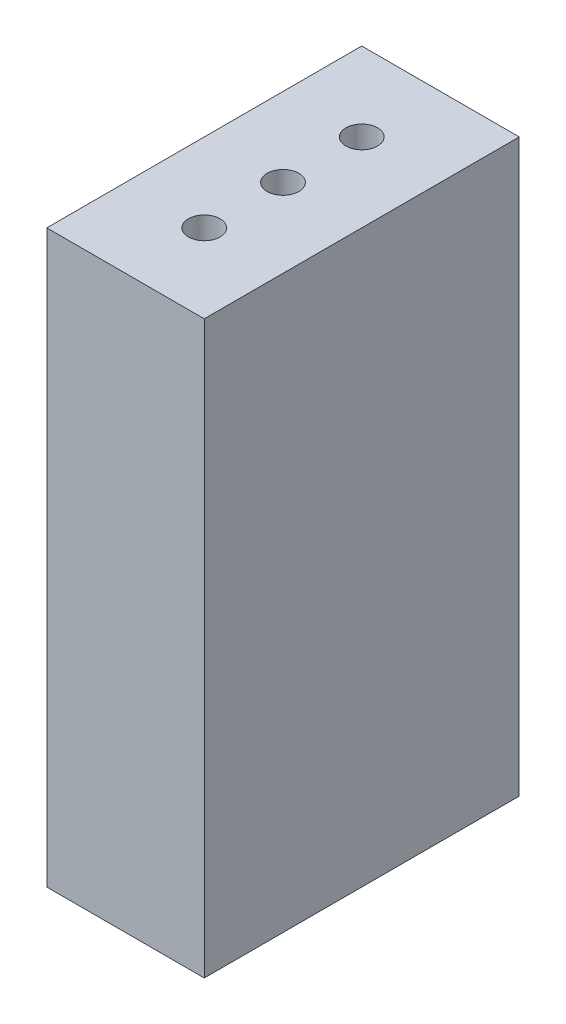
ISO-10303-21;
HEADER;
FILE_DESCRIPTION(('STEP AP214'),'2;1');
FILE_NAME('part.step','',(''),(''),'','','');
FILE_SCHEMA(('AUTOMOTIVE_DESIGN { 1 0 10303 214 1 1 1 1 }'));
ENDSEC;
DATA;
#1=APPLICATION_CONTEXT('core data for automotive mechanical design processes');
#2=APPLICATION_PROTOCOL_DEFINITION('international standard','automotive_design',2000,#1);
#3=PRODUCT_CONTEXT('',#1,'mechanical');
#4=PRODUCT('Part','Part','',(#3));
#5=PRODUCT_RELATED_PRODUCT_CATEGORY('part','',(#4));
#6=PRODUCT_DEFINITION_FORMATION('','',#4);
#7=PRODUCT_DEFINITION_CONTEXT('part definition',#1,'design');
#8=PRODUCT_DEFINITION('design','',#6,#7);
#9=PRODUCT_DEFINITION_SHAPE('','',#8);
#10=(LENGTH_UNIT() NAMED_UNIT(*) SI_UNIT(.MILLI.,.METRE.));
#11=(NAMED_UNIT(*) PLANE_ANGLE_UNIT() SI_UNIT($,.RADIAN.));
#12=(NAMED_UNIT(*) SI_UNIT($,.STERADIAN.) SOLID_ANGLE_UNIT());
#13=UNCERTAINTY_MEASURE_WITH_UNIT(LENGTH_MEASURE(1.E-05),#10,'distance_accuracy_value','');
#14=(GEOMETRIC_REPRESENTATION_CONTEXT(3) GLOBAL_UNCERTAINTY_ASSIGNED_CONTEXT((#13)) GLOBAL_UNIT_ASSIGNED_CONTEXT((#10,
#11,#12)) REPRESENTATION_CONTEXT('',''));
#15=CARTESIAN_POINT('',(0.,0.,0.));
#16=DIRECTION('',(0.,0.,1.));
#17=DIRECTION('',(1.,0.,0.));
#18=AXIS2_PLACEMENT_3D('',#15,#16,#17);
#19=CARTESIAN_POINT('',(12.7,92.075,-25.4));
#20=DIRECTION('',(-1.,0.,0.));
#21=DIRECTION('',(0.,0.,1.));
#22=AXIS2_PLACEMENT_3D('',#19,#20,#21);
#23=PLANE('',#22);
#24=DIRECTION('',(0.,0.,-1.));
#25=VECTOR('',#24,1.);
#26=CARTESIAN_POINT('',(12.7,0.,-25.4));
#27=LINE('',#26,#25);
#28=CARTESIAN_POINT('',(12.7,0.,25.4));
#29=VERTEX_POINT('',#28);
#30=CARTESIAN_POINT('',(12.7,0.,-25.4));
#31=VERTEX_POINT('',#30);
#32=EDGE_CURVE('E130',#29,#31,#27,.T.);
#33=ORIENTED_EDGE('',*,*,#32,.T.);
#34=DIRECTION('',(0.,-1.,0.));
#35=VECTOR('',#34,1.);
#36=CARTESIAN_POINT('',(12.7,92.075,-25.4));
#37=LINE('',#36,#35);
#38=CARTESIAN_POINT('',(12.7,92.075,-25.4));
#39=VERTEX_POINT('',#38);
#40=EDGE_CURVE('E11',#39,#31,#37,.T.);
#41=ORIENTED_EDGE('',*,*,#40,.F.);
#42=DIRECTION('',(0.,0.,-1.));
#43=VECTOR('',#42,1.);
#44=CARTESIAN_POINT('',(12.7,92.075,-25.4));
#45=LINE('',#44,#43);
#46=CARTESIAN_POINT('',(12.7,92.075,25.4));
#47=VERTEX_POINT('',#46);
#48=EDGE_CURVE('E131',#47,#39,#45,.T.);
#49=ORIENTED_EDGE('',*,*,#48,.F.);
#50=DIRECTION('',(0.,-1.,0.));
#51=VECTOR('',#50,1.);
#52=CARTESIAN_POINT('',(12.7,92.075,25.4));
#53=LINE('',#52,#51);
#54=EDGE_CURVE('E141',#47,#29,#53,.T.);
#55=ORIENTED_EDGE('',*,*,#54,.T.);
#56=EDGE_LOOP('',(#33,#41,#49,#55));
#57=FACE_BOUND('',#56,.T.);
#58=ADVANCED_FACE('F39',(#57),#23,.F.);
#59=CARTESIAN_POINT('',(-12.7,92.075,-25.4));
#60=DIRECTION('',(0.,0.,1.));
#61=DIRECTION('',(1.,0.,0.));
#62=AXIS2_PLACEMENT_3D('',#59,#60,#61);
#63=PLANE('',#62);
#64=DIRECTION('',(-1.,0.,0.));
#65=VECTOR('',#64,1.);
#66=CARTESIAN_POINT('',(-12.7,0.,-25.4));
#67=LINE('',#66,#65);
#68=CARTESIAN_POINT('',(-12.7,0.,-25.4));
#69=VERTEX_POINT('',#68);
#70=EDGE_CURVE('E145',#31,#69,#67,.T.);
#71=ORIENTED_EDGE('',*,*,#70,.T.);
#72=DIRECTION('',(0.,-1.,0.));
#73=VECTOR('',#72,1.);
#74=CARTESIAN_POINT('',(-12.7,92.075,-25.4));
#75=LINE('',#74,#73);
#76=CARTESIAN_POINT('',(-12.7,92.075,-25.4));
#77=VERTEX_POINT('',#76);
#78=EDGE_CURVE('E48',#77,#69,#75,.T.);
#79=ORIENTED_EDGE('',*,*,#78,.F.);
#80=DIRECTION('',(-1.,0.,0.));
#81=VECTOR('',#80,1.);
#82=CARTESIAN_POINT('',(-12.7,92.075,-25.4));
#83=LINE('',#82,#81);
#84=EDGE_CURVE('E87',#39,#77,#83,.T.);
#85=ORIENTED_EDGE('',*,*,#84,.F.);
#86=ORIENTED_EDGE('',*,*,#40,.T.);
#87=EDGE_LOOP('',(#71,#79,#85,#86));
#88=FACE_BOUND('',#87,.T.);
#89=ADVANCED_FACE('F175',(#88),#63,.F.);
#90=CARTESIAN_POINT('',(-12.7,92.075,-25.4));
#91=DIRECTION('',(1.,0.,0.));
#92=DIRECTION('',(0.,0.,-1.));
#93=AXIS2_PLACEMENT_3D('',#90,#91,#92);
#94=PLANE('',#93);
#95=DIRECTION('',(0.,0.,1.));
#96=VECTOR('',#95,1.);
#97=CARTESIAN_POINT('',(-12.7,0.,-25.4));
#98=LINE('',#97,#96);
#99=CARTESIAN_POINT('',(-12.7,0.,25.4));
#100=VERTEX_POINT('',#99);
#101=EDGE_CURVE('E74',#69,#100,#98,.T.);
#102=ORIENTED_EDGE('',*,*,#101,.T.);
#103=DIRECTION('',(0.,-1.,0.));
#104=VECTOR('',#103,1.);
#105=CARTESIAN_POINT('',(-12.7,92.075,25.4));
#106=LINE('',#105,#104);
#107=CARTESIAN_POINT('',(-12.7,92.075,25.4));
#108=VERTEX_POINT('',#107);
#109=EDGE_CURVE('E154',#108,#100,#106,.T.);
#110=ORIENTED_EDGE('',*,*,#109,.F.);
#111=DIRECTION('',(0.,0.,1.));
#112=VECTOR('',#111,1.);
#113=CARTESIAN_POINT('',(-12.7,92.075,-25.4));
#114=LINE('',#113,#112);
#115=EDGE_CURVE('E136',#77,#108,#114,.T.);
#116=ORIENTED_EDGE('',*,*,#115,.F.);
#117=ORIENTED_EDGE('',*,*,#78,.T.);
#118=EDGE_LOOP('',(#102,#110,#116,#117));
#119=FACE_BOUND('',#118,.T.);
#120=ADVANCED_FACE('F158',(#119),#94,.F.);
#121=CARTESIAN_POINT('',(-12.7,92.075,25.4));
#122=DIRECTION('',(0.,0.,-1.));
#123=DIRECTION('',(-1.,0.,0.));
#124=AXIS2_PLACEMENT_3D('',#121,#122,#123);
#125=PLANE('',#124);
#126=DIRECTION('',(1.,0.,0.));
#127=VECTOR('',#126,1.);
#128=CARTESIAN_POINT('',(-12.7,0.,25.4));
#129=LINE('',#128,#127);
#130=EDGE_CURVE('E80',#100,#29,#129,.T.);
#131=ORIENTED_EDGE('',*,*,#130,.T.);
#132=ORIENTED_EDGE('',*,*,#54,.F.);
#133=DIRECTION('',(1.,0.,0.));
#134=VECTOR('',#133,1.);
#135=CARTESIAN_POINT('',(-12.7,92.075,25.4));
#136=LINE('',#135,#134);
#137=EDGE_CURVE('E56',#108,#47,#136,.T.);
#138=ORIENTED_EDGE('',*,*,#137,.F.);
#139=ORIENTED_EDGE('',*,*,#109,.T.);
#140=EDGE_LOOP('',(#131,#132,#138,#139));
#141=FACE_BOUND('',#140,.T.);
#142=ADVANCED_FACE('F165',(#141),#125,.F.);
#143=CARTESIAN_POINT('',(0.,92.075,0.));
#144=DIRECTION('',(0.,1.,0.));
#145=DIRECTION('',(0.,0.,1.));
#146=AXIS2_PLACEMENT_3D('',#143,#144,#145);
#147=PLANE('',#146);
#148=CARTESIAN_POINT('',(0.,92.075,-12.7));
#149=DIRECTION('',(0.,1.,0.));
#150=DIRECTION('',(0.,0.,1.));
#151=AXIS2_PLACEMENT_3D('',#148,#149,#150);
#152=CIRCLE('',#151,2.55269999999999);
#153=CARTESIAN_POINT('',(0.,92.075,-10.1473));
#154=VERTEX_POINT('',#153);
#155=EDGE_CURVE('E109',#154,#154,#152,.T.);
#156=ORIENTED_EDGE('',*,*,#155,.F.);
#157=EDGE_LOOP('',(#156));
#158=FACE_BOUND('',#157,.T.);
#159=CARTESIAN_POINT('',(0.,92.075,0.));
#160=DIRECTION('',(0.,1.,0.));
#161=DIRECTION('',(0.,0.,1.));
#162=AXIS2_PLACEMENT_3D('',#159,#160,#161);
#163=CIRCLE('',#162,2.55269999999999);
#164=CARTESIAN_POINT('',(0.,92.075,2.55269999999999));
#165=VERTEX_POINT('',#164);
#166=EDGE_CURVE('E108',#165,#165,#163,.T.);
#167=ORIENTED_EDGE('',*,*,#166,.F.);
#168=EDGE_LOOP('',(#167));
#169=FACE_BOUND('',#168,.T.);
#170=CARTESIAN_POINT('',(0.,92.075,12.7));
#171=DIRECTION('',(0.,1.,0.));
#172=DIRECTION('',(0.,0.,1.));
#173=AXIS2_PLACEMENT_3D('',#170,#171,#172);
#174=CIRCLE('',#173,2.55269999999999);
#175=CARTESIAN_POINT('',(0.,92.075,15.2527));
#176=VERTEX_POINT('',#175);
#177=EDGE_CURVE('E122',#176,#176,#174,.T.);
#178=ORIENTED_EDGE('',*,*,#177,.F.);
#179=EDGE_LOOP('',(#178));
#180=FACE_BOUND('',#179,.T.);
#181=ORIENTED_EDGE('',*,*,#48,.T.);
#182=ORIENTED_EDGE('',*,*,#84,.T.);
#183=ORIENTED_EDGE('',*,*,#115,.T.);
#184=ORIENTED_EDGE('',*,*,#137,.T.);
#185=EDGE_LOOP('',(#181,#182,#183,#184));
#186=FACE_BOUND('',#185,.T.);
#187=ADVANCED_FACE('F167',(#158,#169,#180,#186),#147,.T.);
#188=CARTESIAN_POINT('',(0.,0.,0.));
#189=DIRECTION('',(0.,1.,0.));
#190=DIRECTION('',(0.,0.,1.));
#191=AXIS2_PLACEMENT_3D('',#188,#189,#190);
#192=PLANE('',#191);
#193=ORIENTED_EDGE('',*,*,#32,.F.);
#194=ORIENTED_EDGE('',*,*,#130,.F.);
#195=ORIENTED_EDGE('',*,*,#101,.F.);
#196=ORIENTED_EDGE('',*,*,#70,.F.);
#197=EDGE_LOOP('',(#193,#194,#195,#196));
#198=FACE_BOUND('',#197,.T.);
#199=ADVANCED_FACE('F161',(#198),#192,.F.);
#200=CARTESIAN_POINT('',(0.,75.565,12.7));
#201=DIRECTION('',(0.,1.,0.));
#202=DIRECTION('',(0.,0.,1.));
#203=AXIS2_PLACEMENT_3D('',#200,#201,#202);
#204=CONICAL_SURFACE('',#203,2.55269999999999,1.02974425867665);
#205=CARTESIAN_POINT('',(0.,74.0311830978084,12.7));
#206=VERTEX_POINT('',#205);
#207=VERTEX_LOOP('',#206);
#208=FACE_BOUND('',#207,.T.);
#209=CARTESIAN_POINT('',(0.,75.565,12.7));
#210=DIRECTION('',(0.,1.,0.));
#211=DIRECTION('',(0.,0.,1.));
#212=AXIS2_PLACEMENT_3D('',#209,#210,#211);
#213=CIRCLE('',#212,2.55269999999999);
#214=CARTESIAN_POINT('',(0.,75.565,15.2527));
#215=VERTEX_POINT('',#214);
#216=EDGE_CURVE('E126',#215,#215,#213,.T.);
#217=ORIENTED_EDGE('',*,*,#216,.T.);
#218=EDGE_LOOP('',(#217));
#219=FACE_BOUND('',#218,.T.);
#220=ADVANCED_FACE('F202',(#208,#219),#204,.F.);
#221=CARTESIAN_POINT('',(0.,92.075,12.7));
#222=DIRECTION('',(0.,1.,0.));
#223=DIRECTION('',(0.,0.,1.));
#224=AXIS2_PLACEMENT_3D('',#221,#222,#223);
#225=CYLINDRICAL_SURFACE('',#224,2.55269999999999);
#226=ORIENTED_EDGE('',*,*,#216,.F.);
#227=EDGE_LOOP('',(#226));
#228=FACE_BOUND('',#227,.T.);
#229=ORIENTED_EDGE('',*,*,#177,.T.);
#230=EDGE_LOOP('',(#229));
#231=FACE_BOUND('',#230,.T.);
#232=ADVANCED_FACE('F215',(#228,#231),#225,.F.);
#233=CARTESIAN_POINT('',(0.,75.565,0.));
#234=DIRECTION('',(0.,1.,0.));
#235=DIRECTION('',(0.,0.,1.));
#236=AXIS2_PLACEMENT_3D('',#233,#234,#235);
#237=CONICAL_SURFACE('',#236,2.55269999999999,1.02974425867665);
#238=CARTESIAN_POINT('',(0.,74.0311830978084,0.));
#239=VERTEX_POINT('',#238);
#240=VERTEX_LOOP('',#239);
#241=FACE_BOUND('',#240,.T.);
#242=CARTESIAN_POINT('',(0.,75.565,0.));
#243=DIRECTION('',(0.,1.,0.));
#244=DIRECTION('',(0.,0.,1.));
#245=AXIS2_PLACEMENT_3D('',#242,#243,#244);
#246=CIRCLE('',#245,2.55269999999999);
#247=CARTESIAN_POINT('',(0.,75.565,2.55269999999999));
#248=VERTEX_POINT('',#247);
#249=EDGE_CURVE('E114',#248,#248,#246,.T.);
#250=ORIENTED_EDGE('',*,*,#249,.T.);
#251=EDGE_LOOP('',(#250));
#252=FACE_BOUND('',#251,.T.);
#253=ADVANCED_FACE('F225',(#241,#252),#237,.F.);
#254=CARTESIAN_POINT('',(0.,92.075,0.));
#255=DIRECTION('',(0.,1.,0.));
#256=DIRECTION('',(0.,0.,1.));
#257=AXIS2_PLACEMENT_3D('',#254,#255,#256);
#258=CYLINDRICAL_SURFACE('',#257,2.55269999999999);
#259=ORIENTED_EDGE('',*,*,#249,.F.);
#260=EDGE_LOOP('',(#259));
#261=FACE_BOUND('',#260,.T.);
#262=ORIENTED_EDGE('',*,*,#166,.T.);
#263=EDGE_LOOP('',(#262));
#264=FACE_BOUND('',#263,.T.);
#265=ADVANCED_FACE('F101',(#261,#264),#258,.F.);
#266=CARTESIAN_POINT('',(0.,75.565,-12.7));
#267=DIRECTION('',(0.,1.,0.));
#268=DIRECTION('',(0.,0.,1.));
#269=AXIS2_PLACEMENT_3D('',#266,#267,#268);
#270=CONICAL_SURFACE('',#269,2.55269999999999,1.02974425867665);
#271=CARTESIAN_POINT('',(0.,74.0311830978084,-12.7));
#272=VERTEX_POINT('',#271);
#273=VERTEX_LOOP('',#272);
#274=FACE_BOUND('',#273,.T.);
#275=CARTESIAN_POINT('',(0.,75.565,-12.7));
#276=DIRECTION('',(0.,1.,0.));
#277=DIRECTION('',(0.,0.,1.));
#278=AXIS2_PLACEMENT_3D('',#275,#276,#277);
#279=CIRCLE('',#278,2.55269999999999);
#280=CARTESIAN_POINT('',(0.,75.565,-10.1473));
#281=VERTEX_POINT('',#280);
#282=EDGE_CURVE('E105',#281,#281,#279,.T.);
#283=ORIENTED_EDGE('',*,*,#282,.T.);
#284=EDGE_LOOP('',(#283));
#285=FACE_BOUND('',#284,.T.);
#286=ADVANCED_FACE('F97',(#274,#285),#270,.F.);
#287=CARTESIAN_POINT('',(0.,92.075,-12.7));
#288=DIRECTION('',(0.,1.,0.));
#289=DIRECTION('',(0.,0.,1.));
#290=AXIS2_PLACEMENT_3D('',#287,#288,#289);
#291=CYLINDRICAL_SURFACE('',#290,2.55269999999999);
#292=ORIENTED_EDGE('',*,*,#282,.F.);
#293=EDGE_LOOP('',(#292));
#294=FACE_BOUND('',#293,.T.);
#295=ORIENTED_EDGE('',*,*,#155,.T.);
#296=EDGE_LOOP('',(#295));
#297=FACE_BOUND('',#296,.T.);
#298=ADVANCED_FACE('F100',(#294,#297),#291,.F.);
#299=CLOSED_SHELL('',(#58,#89,#120,#142,#187,#199,#220,#232,#253,#265,#286,#298));
#300=MANIFOLD_SOLID_BREP('B2',#299);
#301=ADVANCED_BREP_SHAPE_REPRESENTATION('',(#18,#300),#14);
#302=SHAPE_DEFINITION_REPRESENTATION(#9,#301);
ENDSEC;
END-ISO-10303-21;
